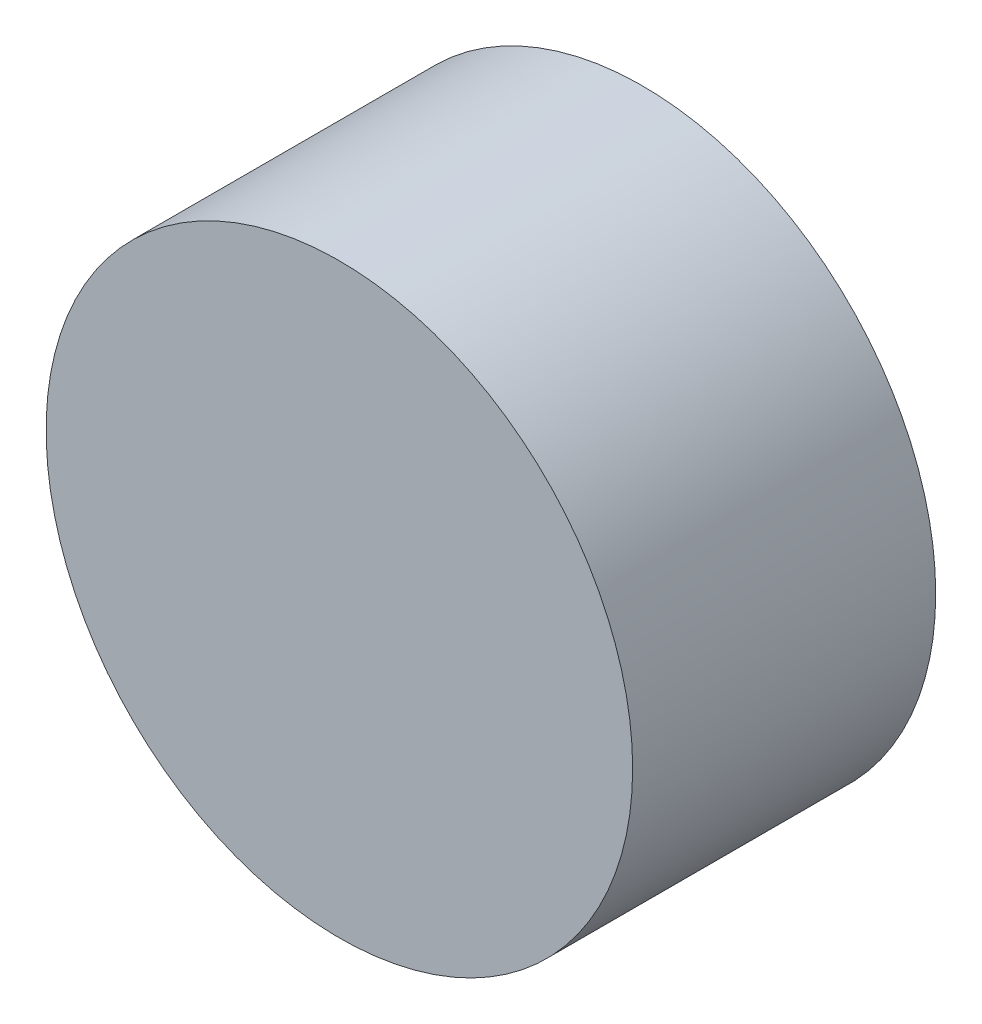
ISO-10303-21;
HEADER;
FILE_DESCRIPTION(('STEP AP214'),'2;1');
FILE_NAME('part.step','',(''),(''),'','','');
FILE_SCHEMA(('AUTOMOTIVE_DESIGN { 1 0 10303 214 1 1 1 1 }'));
ENDSEC;
DATA;
#1=APPLICATION_CONTEXT('core data for automotive mechanical design processes');
#2=APPLICATION_PROTOCOL_DEFINITION('international standard','automotive_design',2000,#1);
#3=PRODUCT_CONTEXT('',#1,'mechanical');
#4=PRODUCT('Part','Part','',(#3));
#5=PRODUCT_RELATED_PRODUCT_CATEGORY('part','',(#4));
#6=PRODUCT_DEFINITION_FORMATION('','',#4);
#7=PRODUCT_DEFINITION_CONTEXT('part definition',#1,'design');
#8=PRODUCT_DEFINITION('design','',#6,#7);
#9=PRODUCT_DEFINITION_SHAPE('','',#8);
#10=(LENGTH_UNIT() NAMED_UNIT(*) SI_UNIT(.MILLI.,.METRE.));
#11=(NAMED_UNIT(*) PLANE_ANGLE_UNIT() SI_UNIT($,.RADIAN.));
#12=(NAMED_UNIT(*) SI_UNIT($,.STERADIAN.) SOLID_ANGLE_UNIT());
#13=UNCERTAINTY_MEASURE_WITH_UNIT(LENGTH_MEASURE(1.E-05),#10,'distance_accuracy_value','');
#14=(GEOMETRIC_REPRESENTATION_CONTEXT(3) GLOBAL_UNCERTAINTY_ASSIGNED_CONTEXT((#13)) GLOBAL_UNIT_ASSIGNED_CONTEXT((#10,
#11,#12)) REPRESENTATION_CONTEXT('',''));
#15=CARTESIAN_POINT('',(0.,0.,0.));
#16=DIRECTION('',(0.,0.,1.));
#17=DIRECTION('',(1.,0.,0.));
#18=AXIS2_PLACEMENT_3D('',#15,#16,#17);
#19=CARTESIAN_POINT('',(-15.8218147430848,16.0036746826605,31.));
#20=DIRECTION('',(0.,0.,-1.));
#21=DIRECTION('',(-1.,0.,0.));
#22=AXIS2_PLACEMENT_3D('',#19,#20,#21);
#23=CYLINDRICAL_SURFACE('',#22,30.);
#24=CARTESIAN_POINT('',(-15.8218147430848,16.0036746826605,31.));
#25=DIRECTION('',(0.,0.,1.));
#26=DIRECTION('',(1.,0.,0.));
#27=AXIS2_PLACEMENT_3D('',#24,#25,#26);
#28=CIRCLE('',#27,30.);
#29=CARTESIAN_POINT('',(14.1781852569152,16.0036746826605,31.));
#30=VERTEX_POINT('',#29);
#31=EDGE_CURVE('E10',#30,#30,#28,.T.);
#32=ORIENTED_EDGE('',*,*,#31,.F.);
#33=EDGE_LOOP('',(#32));
#34=FACE_BOUND('',#33,.T.);
#35=CARTESIAN_POINT('',(-15.8218147430848,16.0036746826605,0.));
#36=DIRECTION('',(0.,0.,1.));
#37=DIRECTION('',(1.,0.,0.));
#38=AXIS2_PLACEMENT_3D('',#35,#36,#37);
#39=CIRCLE('',#38,30.);
#40=CARTESIAN_POINT('',(14.1781852569152,16.0036746826605,0.));
#41=VERTEX_POINT('',#40);
#42=EDGE_CURVE('E44',#41,#41,#39,.T.);
#43=ORIENTED_EDGE('',*,*,#42,.T.);
#44=EDGE_LOOP('',(#43));
#45=FACE_BOUND('',#44,.T.);
#46=ADVANCED_FACE('F41',(#34,#45),#23,.T.);
#47=CARTESIAN_POINT('',(-15.8218147430848,16.0036746826605,31.));
#48=DIRECTION('',(0.,0.,1.));
#49=DIRECTION('',(1.,0.,0.));
#50=AXIS2_PLACEMENT_3D('',#47,#48,#49);
#51=PLANE('',#50);
#52=ORIENTED_EDGE('',*,*,#31,.T.);
#53=EDGE_LOOP('',(#52));
#54=FACE_BOUND('',#53,.T.);
#55=ADVANCED_FACE('F58',(#54),#51,.T.);
#56=CARTESIAN_POINT('',(-15.8218147430848,16.0036746826605,0.));
#57=DIRECTION('',(0.,0.,1.));
#58=DIRECTION('',(1.,0.,0.));
#59=AXIS2_PLACEMENT_3D('',#56,#57,#58);
#60=PLANE('',#59);
#61=ORIENTED_EDGE('',*,*,#42,.F.);
#62=EDGE_LOOP('',(#61));
#63=FACE_BOUND('',#62,.T.);
#64=ADVANCED_FACE('F56',(#63),#60,.F.);
#65=CLOSED_SHELL('',(#46,#55,#64));
#66=MANIFOLD_SOLID_BREP('B2',#65);
#67=ADVANCED_BREP_SHAPE_REPRESENTATION('',(#18,#66),#14);
#68=SHAPE_DEFINITION_REPRESENTATION(#9,#67);
ENDSEC;
END-ISO-10303-21;
